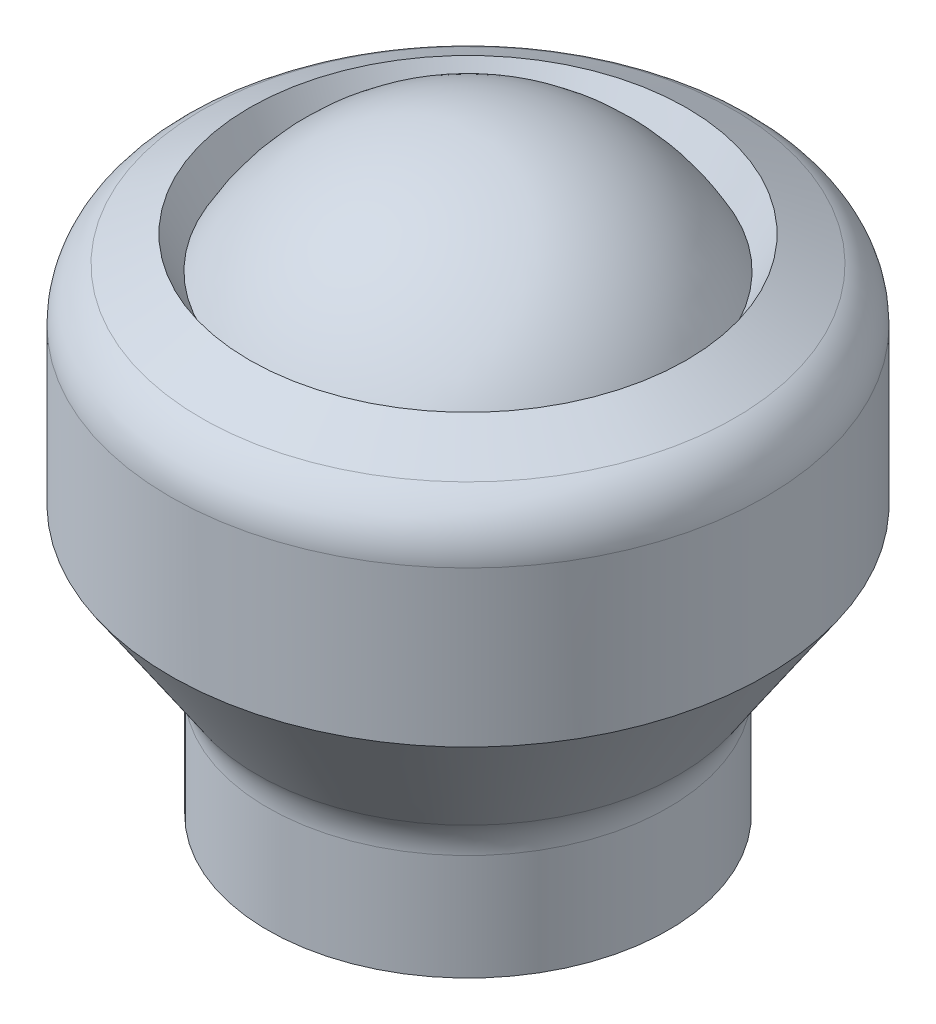
ISO-10303-21;
HEADER;
FILE_DESCRIPTION(('STEP AP214'),'2;1');
FILE_NAME('part.step','',(''),(''),'','','');
FILE_SCHEMA(('AUTOMOTIVE_DESIGN { 1 0 10303 214 1 1 1 1 }'));
ENDSEC;
DATA;
#1=APPLICATION_CONTEXT('core data for automotive mechanical design processes');
#2=APPLICATION_PROTOCOL_DEFINITION('international standard','automotive_design',2000,#1);
#3=PRODUCT_CONTEXT('',#1,'mechanical');
#4=PRODUCT('Part','Part','',(#3));
#5=PRODUCT_RELATED_PRODUCT_CATEGORY('part','',(#4));
#6=PRODUCT_DEFINITION_FORMATION('','',#4);
#7=PRODUCT_DEFINITION_CONTEXT('part definition',#1,'design');
#8=PRODUCT_DEFINITION('design','',#6,#7);
#9=PRODUCT_DEFINITION_SHAPE('','',#8);
#10=(LENGTH_UNIT() NAMED_UNIT(*) SI_UNIT(.MILLI.,.METRE.));
#11=(NAMED_UNIT(*) PLANE_ANGLE_UNIT() SI_UNIT($,.RADIAN.));
#12=(NAMED_UNIT(*) SI_UNIT($,.STERADIAN.) SOLID_ANGLE_UNIT());
#13=UNCERTAINTY_MEASURE_WITH_UNIT(LENGTH_MEASURE(1.E-05),#10,'distance_accuracy_value','');
#14=(GEOMETRIC_REPRESENTATION_CONTEXT(3) GLOBAL_UNCERTAINTY_ASSIGNED_CONTEXT((#13)) GLOBAL_UNIT_ASSIGNED_CONTEXT((#10,
#11,#12)) REPRESENTATION_CONTEXT('',''));
#15=CARTESIAN_POINT('',(0.,0.,0.));
#16=DIRECTION('',(0.,0.,1.));
#17=DIRECTION('',(1.,0.,0.));
#18=AXIS2_PLACEMENT_3D('',#15,#16,#17);
#19=CARTESIAN_POINT('',(34.4364305436758,22.7872565072201,0.));
#20=DIRECTION('',(0.,-1.,0.));
#21=DIRECTION('',(1.,0.,0.));
#22=AXIS2_PLACEMENT_3D('',#19,#20,#21);
#23=CONICAL_SURFACE('',#22,9.9440049653144,1.0703832382156);
#24=CARTESIAN_POINT('',(34.4364305436758,23.3562008920342,0.));
#25=DIRECTION('',(0.,1.,0.));
#26=DIRECTION('',(-1.,0.,0.));
#27=AXIS2_PLACEMENT_3D('',#24,#25,#26);
#28=CIRCLE('',#27,8.90358099935939);
#29=CARTESIAN_POINT('',(25.5328495443164,23.3562008920342,0.));
#30=VERTEX_POINT('',#29);
#31=EDGE_CURVE('E50',#30,#30,#28,.T.);
#32=ORIENTED_EDGE('',*,*,#31,.T.);
#33=EDGE_LOOP('',(#32));
#34=FACE_BOUND('',#33,.T.);
#35=CARTESIAN_POINT('',(34.4364305436758,24.2336782078357,0.));
#36=DIRECTION('',(0.,1.,0.));
#37=DIRECTION('',(-1.,0.,0.));
#38=AXIS2_PLACEMENT_3D('',#35,#36,#37);
#39=CIRCLE('',#38,7.29894537361161);
#40=CARTESIAN_POINT('',(27.1374851700642,24.2336782078357,0.));
#41=VERTEX_POINT('',#40);
#42=EDGE_CURVE('E67',#41,#41,#39,.T.);
#43=ORIENTED_EDGE('',*,*,#42,.F.);
#44=EDGE_LOOP('',(#43));
#45=FACE_BOUND('',#44,.T.);
#46=ADVANCED_FACE('F35',(#34,#45),#23,.T.);
#47=CARTESIAN_POINT('',(34.4364305436758,24.2336782078357,0.));
#48=DIRECTION('',(0.,1.,0.));
#49=DIRECTION('',(-1.,0.,0.));
#50=AXIS2_PLACEMENT_3D('',#47,#48,#49);
#51=CONICAL_SURFACE('',#50,7.29894537361161,0.500413088579311);
#52=CARTESIAN_POINT('',(34.4364305436758,23.1550454420705,0.));
#53=DIRECTION('',(0.,1.,0.));
#54=DIRECTION('',(-1.,0.,0.));
#55=AXIS2_PLACEMENT_3D('',#52,#53,#54);
#56=CIRCLE('',#55,6.70910692751688);
#57=CARTESIAN_POINT('',(27.7273236161589,23.1550454420705,0.));
#58=VERTEX_POINT('',#57);
#59=EDGE_CURVE('E70',#58,#58,#56,.T.);
#60=ORIENTED_EDGE('',*,*,#59,.F.);
#61=EDGE_LOOP('',(#60));
#62=FACE_BOUND('',#61,.T.);
#63=ORIENTED_EDGE('',*,*,#42,.T.);
#64=EDGE_LOOP('',(#63));
#65=FACE_BOUND('',#64,.T.);
#66=ADVANCED_FACE('F76',(#62,#65),#51,.F.);
#67=CARTESIAN_POINT('',(34.4364305436758,19.5376156120694,0.));
#68=DIRECTION('',(0.,1.,0.));
#69=DIRECTION('',(1.,0.,0.));
#70=AXIS2_PLACEMENT_3D('',#67,#68,#69);
#71=SPHERICAL_SURFACE('',#70,7.62219878642881);
#72=ORIENTED_EDGE('',*,*,#59,.T.);
#73=EDGE_LOOP('',(#72));
#74=FACE_BOUND('',#73,.T.);
#75=ADVANCED_FACE('F74',(#74),#71,.T.);
#76=CARTESIAN_POINT('',(34.4364305436758,27.1598143984982,0.));
#77=DIRECTION('',(0.,1.,0.));
#78=DIRECTION('',(-1.,0.,0.));
#79=AXIS2_PLACEMENT_3D('',#76,#77,#78);
#80=CYLINDRICAL_SURFACE('',#79,9.9440049653144);
#81=CARTESIAN_POINT('',(34.4364305436758,21.601432008424,0.));
#82=DIRECTION('',(0.,-1.,0.));
#83=DIRECTION('',(1.,0.,0.));
#84=AXIS2_PLACEMENT_3D('',#81,#82,#83);
#85=CIRCLE('',#84,9.9440049653144);
#86=CARTESIAN_POINT('',(44.3804355089902,21.601432008424,0.));
#87=VERTEX_POINT('',#86);
#88=EDGE_CURVE('E46',#87,#87,#85,.T.);
#89=ORIENTED_EDGE('',*,*,#88,.T.);
#90=EDGE_LOOP('',(#89));
#91=FACE_BOUND('',#90,.T.);
#92=CARTESIAN_POINT('',(34.4364305436758,16.4214750023716,0.));
#93=DIRECTION('',(0.,1.,0.));
#94=DIRECTION('',(-1.,0.,0.));
#95=AXIS2_PLACEMENT_3D('',#92,#93,#94);
#96=CIRCLE('',#95,9.9440049653144);
#97=CARTESIAN_POINT('',(24.4924255783614,16.4214750023716,0.));
#98=VERTEX_POINT('',#97);
#99=EDGE_CURVE('E64',#98,#98,#96,.T.);
#100=ORIENTED_EDGE('',*,*,#99,.T.);
#101=EDGE_LOOP('',(#100));
#102=FACE_BOUND('',#101,.T.);
#103=ADVANCED_FACE('F89',(#91,#102),#80,.T.);
#104=CARTESIAN_POINT('',(34.4364305436758,11.5962231884157,0.));
#105=DIRECTION('',(0.,1.,0.));
#106=DIRECTION('',(-1.,0.,0.));
#107=AXIS2_PLACEMENT_3D('',#104,#105,#106);
#108=CONICAL_SURFACE('',#107,6.69102621433289,0.593170516196373);
#109=CARTESIAN_POINT('',(34.4364305436758,12.1030112780821,0.));
#110=DIRECTION('',(0.,1.,0.));
#111=DIRECTION('',(-1.,0.,0.));
#112=AXIS2_PLACEMENT_3D('',#109,#110,#111);
#113=CIRCLE('',#112,7.03268110624283);
#114=CARTESIAN_POINT('',(27.403749437433,12.1030112780821,0.));
#115=VERTEX_POINT('',#114);
#116=EDGE_CURVE('E42',#115,#115,#113,.T.);
#117=ORIENTED_EDGE('',*,*,#116,.T.);
#118=EDGE_LOOP('',(#117));
#119=FACE_BOUND('',#118,.T.);
#120=ORIENTED_EDGE('',*,*,#99,.F.);
#121=EDGE_LOOP('',(#120));
#122=FACE_BOUND('',#121,.T.);
#123=ADVANCED_FACE('F94',(#119,#122),#108,.T.);
#124=CARTESIAN_POINT('',(34.4364305436758,27.1598143984982,0.));
#125=DIRECTION('',(0.,1.,0.));
#126=DIRECTION('',(-1.,0.,0.));
#127=AXIS2_PLACEMENT_3D('',#124,#125,#126);
#128=CYLINDRICAL_SURFACE('',#127,6.69102621433289);
#129=CARTESIAN_POINT('',(34.4364305436758,10.985025811954,0.));
#130=DIRECTION('',(0.,1.,0.));
#131=DIRECTION('',(-1.,0.,0.));
#132=AXIS2_PLACEMENT_3D('',#129,#130,#131);
#133=CIRCLE('',#132,6.69102621433289);
#134=CARTESIAN_POINT('',(27.7454043293429,10.985025811954,0.));
#135=VERTEX_POINT('',#134);
#136=EDGE_CURVE('E10',#135,#135,#133,.F.);
#137=ORIENTED_EDGE('',*,*,#136,.T.);
#138=EDGE_LOOP('',(#137));
#139=FACE_BOUND('',#138,.T.);
#140=CARTESIAN_POINT('',(34.4364305436758,7.44216566370547,0.));
#141=DIRECTION('',(0.,1.,0.));
#142=DIRECTION('',(-1.,0.,0.));
#143=AXIS2_PLACEMENT_3D('',#140,#141,#142);
#144=CIRCLE('',#143,6.69102621433289);
#145=CARTESIAN_POINT('',(27.7454043293429,7.44216566370547,0.));
#146=VERTEX_POINT('',#145);
#147=EDGE_CURVE('E61',#146,#146,#144,.T.);
#148=ORIENTED_EDGE('',*,*,#147,.T.);
#149=EDGE_LOOP('',(#148));
#150=FACE_BOUND('',#149,.T.);
#151=ADVANCED_FACE('F116',(#139,#150),#128,.T.);
#152=CARTESIAN_POINT('',(0.,7.44216566370548,0.));
#153=DIRECTION('',(0.,1.,0.));
#154=DIRECTION('',(-1.,0.,0.));
#155=AXIS2_PLACEMENT_3D('',#152,#153,#154);
#156=PLANE('',#155);
#157=ORIENTED_EDGE('',*,*,#147,.F.);
#158=EDGE_LOOP('',(#157));
#159=FACE_BOUND('',#158,.T.);
#160=CARTESIAN_POINT('',(34.4364305436758,7.44216566370546,0.));
#161=DIRECTION('',(0.,1.,0.));
#162=DIRECTION('',(-1.,0.,0.));
#163=AXIS2_PLACEMENT_3D('',#160,#161,#162);
#164=CIRCLE('',#163,2.00000000000001);
#165=CARTESIAN_POINT('',(32.4364305436758,7.44216566370546,0.));
#166=VERTEX_POINT('',#165);
#167=EDGE_CURVE('E58',#166,#166,#164,.T.);
#168=ORIENTED_EDGE('',*,*,#167,.T.);
#169=EDGE_LOOP('',(#168));
#170=FACE_BOUND('',#169,.T.);
#171=ADVANCED_FACE('F121',(#159,#170),#156,.F.);
#172=CARTESIAN_POINT('',(34.4364305436758,27.1598143984982,0.));
#173=DIRECTION('',(0.,1.,0.));
#174=DIRECTION('',(-1.,0.,0.));
#175=AXIS2_PLACEMENT_3D('',#172,#173,#174);
#176=CYLINDRICAL_SURFACE('',#175,2.00000000000001);
#177=ORIENTED_EDGE('',*,*,#167,.F.);
#178=EDGE_LOOP('',(#177));
#179=FACE_BOUND('',#178,.T.);
#180=CARTESIAN_POINT('',(34.4364305436758,4.44216566370546,0.));
#181=DIRECTION('',(0.,1.,0.));
#182=DIRECTION('',(-1.,0.,0.));
#183=AXIS2_PLACEMENT_3D('',#180,#181,#182);
#184=CIRCLE('',#183,2.00000000000001);
#185=CARTESIAN_POINT('',(32.4364305436758,4.44216566370546,0.));
#186=VERTEX_POINT('',#185);
#187=EDGE_CURVE('E55',#186,#186,#184,.T.);
#188=ORIENTED_EDGE('',*,*,#187,.T.);
#189=EDGE_LOOP('',(#188));
#190=FACE_BOUND('',#189,.T.);
#191=ADVANCED_FACE('F107',(#179,#190),#176,.T.);
#192=CARTESIAN_POINT('',(0.,4.44216566370548,0.));
#193=DIRECTION('',(0.,1.,0.));
#194=DIRECTION('',(-1.,0.,0.));
#195=AXIS2_PLACEMENT_3D('',#192,#193,#194);
#196=PLANE('',#195);
#197=ORIENTED_EDGE('',*,*,#187,.F.);
#198=EDGE_LOOP('',(#197));
#199=FACE_BOUND('',#198,.T.);
#200=ADVANCED_FACE('F97',(#199),#196,.F.);
#201=CARTESIAN_POINT('',(34.4364305436758,21.601432008424,0.));
#202=DIRECTION('',(0.,-1.,0.));
#203=DIRECTION('',(1.,0.,0.));
#204=AXIS2_PLACEMENT_3D('',#201,#202,#203);
#205=TOROIDAL_SURFACE('',#204,7.9440049653144,2.);
#206=ORIENTED_EDGE('',*,*,#88,.F.);
#207=EDGE_LOOP('',(#206));
#208=FACE_BOUND('',#207,.T.);
#209=ORIENTED_EDGE('',*,*,#31,.F.);
#210=EDGE_LOOP('',(#209));
#211=FACE_BOUND('',#210,.T.);
#212=ADVANCED_FACE('F99',(#208,#211),#205,.T.);
#213=CARTESIAN_POINT('',(34.4364305436758,10.985025811954,0.));
#214=DIRECTION('',(0.,1.,0.));
#215=DIRECTION('',(-1.,0.,0.));
#216=AXIS2_PLACEMENT_3D('',#213,#214,#215);
#217=TOROIDAL_SURFACE('',#216,8.6910262143329,2.);
#218=ORIENTED_EDGE('',*,*,#136,.F.);
#219=EDGE_LOOP('',(#218));
#220=FACE_BOUND('',#219,.T.);
#221=ORIENTED_EDGE('',*,*,#116,.F.);
#222=EDGE_LOOP('',(#221));
#223=FACE_BOUND('',#222,.T.);
#224=ADVANCED_FACE('F37',(#220,#223),#217,.F.);
#225=CLOSED_SHELL('',(#46,#66,#75,#103,#123,#151,#171,#191,#200,#212,#224));
#226=MANIFOLD_SOLID_BREP('B2',#225);
#227=ADVANCED_BREP_SHAPE_REPRESENTATION('',(#18,#226),#14);
#228=SHAPE_DEFINITION_REPRESENTATION(#9,#227);
ENDSEC;
END-ISO-10303-21;
